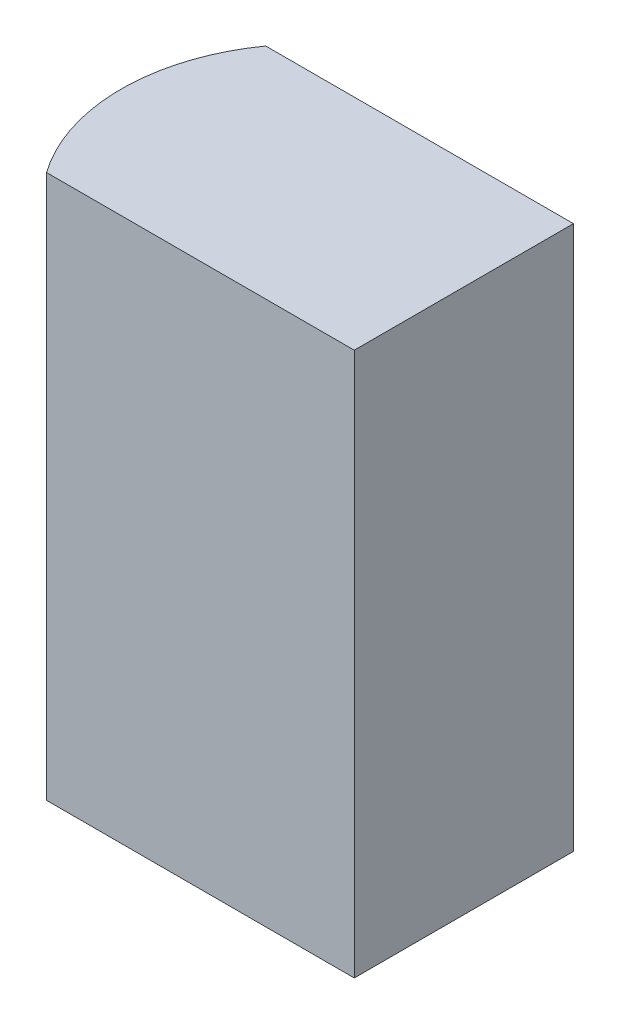
ISO-10303-21;
HEADER;
FILE_DESCRIPTION(('STEP AP214'),'2;1');
FILE_NAME('part.step','',(''),(''),'','','');
FILE_SCHEMA(('AUTOMOTIVE_DESIGN { 1 0 10303 214 1 1 1 1 }'));
ENDSEC;
DATA;
#1=APPLICATION_CONTEXT('core data for automotive mechanical design processes');
#2=APPLICATION_PROTOCOL_DEFINITION('international standard','automotive_design',2000,#1);
#3=PRODUCT_CONTEXT('',#1,'mechanical');
#4=PRODUCT('Part','Part','',(#3));
#5=PRODUCT_RELATED_PRODUCT_CATEGORY('part','',(#4));
#6=PRODUCT_DEFINITION_FORMATION('','',#4);
#7=PRODUCT_DEFINITION_CONTEXT('part definition',#1,'design');
#8=PRODUCT_DEFINITION('design','',#6,#7);
#9=PRODUCT_DEFINITION_SHAPE('','',#8);
#10=(LENGTH_UNIT() NAMED_UNIT(*) SI_UNIT(.MILLI.,.METRE.));
#11=(NAMED_UNIT(*) PLANE_ANGLE_UNIT() SI_UNIT($,.RADIAN.));
#12=(NAMED_UNIT(*) SI_UNIT($,.STERADIAN.) SOLID_ANGLE_UNIT());
#13=UNCERTAINTY_MEASURE_WITH_UNIT(LENGTH_MEASURE(1.E-05),#10,'distance_accuracy_value','');
#14=(GEOMETRIC_REPRESENTATION_CONTEXT(3) GLOBAL_UNCERTAINTY_ASSIGNED_CONTEXT((#13)) GLOBAL_UNIT_ASSIGNED_CONTEXT((#10,
#11,#12)) REPRESENTATION_CONTEXT('',''));
#15=CARTESIAN_POINT('',(0.,0.,0.));
#16=DIRECTION('',(0.,0.,1.));
#17=DIRECTION('',(1.,0.,0.));
#18=AXIS2_PLACEMENT_3D('',#15,#16,#17);
#19=CARTESIAN_POINT('',(182.5,645.,130.));
#20=DIRECTION('',(-1.,0.,0.));
#21=DIRECTION('',(0.,0.,1.));
#22=AXIS2_PLACEMENT_3D('',#19,#20,#21);
#23=PLANE('',#22);
#24=DIRECTION('',(0.,0.,-1.));
#25=VECTOR('',#24,1.);
#26=CARTESIAN_POINT('',(182.5,0.,130.));
#27=LINE('',#26,#25);
#28=CARTESIAN_POINT('',(182.5,0.,130.));
#29=VERTEX_POINT('',#28);
#30=CARTESIAN_POINT('',(182.5,0.,-130.));
#31=VERTEX_POINT('',#30);
#32=EDGE_CURVE('E100',#29,#31,#27,.T.);
#33=ORIENTED_EDGE('',*,*,#32,.T.);
#34=DIRECTION('',(0.,-1.,0.));
#35=VECTOR('',#34,1.);
#36=CARTESIAN_POINT('',(182.5,645.,-130.));
#37=LINE('',#36,#35);
#38=CARTESIAN_POINT('',(182.5,645.,-130.));
#39=VERTEX_POINT('',#38);
#40=EDGE_CURVE('E11',#39,#31,#37,.T.);
#41=ORIENTED_EDGE('',*,*,#40,.F.);
#42=DIRECTION('',(0.,0.,-1.));
#43=VECTOR('',#42,1.);
#44=CARTESIAN_POINT('',(182.5,645.,130.));
#45=LINE('',#44,#43);
#46=CARTESIAN_POINT('',(182.5,645.,130.));
#47=VERTEX_POINT('',#46);
#48=EDGE_CURVE('E88',#47,#39,#45,.T.);
#49=ORIENTED_EDGE('',*,*,#48,.F.);
#50=DIRECTION('',(0.,-1.,0.));
#51=VECTOR('',#50,1.);
#52=CARTESIAN_POINT('',(182.5,645.,130.));
#53=LINE('',#52,#51);
#54=EDGE_CURVE('E96',#47,#29,#53,.T.);
#55=ORIENTED_EDGE('',*,*,#54,.T.);
#56=EDGE_LOOP('',(#33,#41,#49,#55));
#57=FACE_BOUND('',#56,.T.);
#58=ADVANCED_FACE('F37',(#57),#23,.F.);
#59=CARTESIAN_POINT('',(-182.5,645.,-130.));
#60=DIRECTION('',(0.,0.,1.));
#61=DIRECTION('',(1.,0.,0.));
#62=AXIS2_PLACEMENT_3D('',#59,#60,#61);
#63=PLANE('',#62);
#64=DIRECTION('',(-1.,0.,0.));
#65=VECTOR('',#64,1.);
#66=CARTESIAN_POINT('',(-182.5,0.,-130.));
#67=LINE('',#66,#65);
#68=CARTESIAN_POINT('',(-182.5,0.,-130.));
#69=VERTEX_POINT('',#68);
#70=EDGE_CURVE('E92',#31,#69,#67,.T.);
#71=ORIENTED_EDGE('',*,*,#70,.T.);
#72=DIRECTION('',(0.,-1.,0.));
#73=VECTOR('',#72,1.);
#74=CARTESIAN_POINT('',(-182.5,645.,-130.));
#75=LINE('',#74,#73);
#76=CARTESIAN_POINT('',(-182.5,645.,-130.));
#77=VERTEX_POINT('',#76);
#78=EDGE_CURVE('E45',#77,#69,#75,.T.);
#79=ORIENTED_EDGE('',*,*,#78,.F.);
#80=DIRECTION('',(-1.,0.,0.));
#81=VECTOR('',#80,1.);
#82=CARTESIAN_POINT('',(-182.5,645.,-130.));
#83=LINE('',#82,#81);
#84=EDGE_CURVE('E83',#39,#77,#83,.T.);
#85=ORIENTED_EDGE('',*,*,#84,.F.);
#86=ORIENTED_EDGE('',*,*,#40,.T.);
#87=EDGE_LOOP('',(#71,#79,#85,#86));
#88=FACE_BOUND('',#87,.T.);
#89=ADVANCED_FACE('F91',(#88),#63,.F.);
#90=CARTESIAN_POINT('',(0.,645.,0.));
#91=DIRECTION('',(0.,-1.,0.));
#92=DIRECTION('',(0.,0.,-1.));
#93=AXIS2_PLACEMENT_3D('',#90,#91,#92);
#94=CYLINDRICAL_SURFACE('',#93,224.067512147567);
#95=CARTESIAN_POINT('',(0.,0.,0.));
#96=DIRECTION('',(0.,1.,0.));
#97=DIRECTION('',(0.,0.,1.));
#98=AXIS2_PLACEMENT_3D('',#95,#96,#97);
#99=CIRCLE('',#98,224.067512147567);
#100=CARTESIAN_POINT('',(-182.5,0.,130.));
#101=VERTEX_POINT('',#100);
#102=EDGE_CURVE('E70',#69,#101,#99,.T.);
#103=ORIENTED_EDGE('',*,*,#102,.T.);
#104=DIRECTION('',(0.,-1.,0.));
#105=VECTOR('',#104,1.);
#106=CARTESIAN_POINT('',(-182.5,645.,130.));
#107=LINE('',#106,#105);
#108=CARTESIAN_POINT('',(-182.5,645.,130.));
#109=VERTEX_POINT('',#108);
#110=EDGE_CURVE('E93',#109,#101,#107,.T.);
#111=ORIENTED_EDGE('',*,*,#110,.F.);
#112=CARTESIAN_POINT('',(0.,645.,0.));
#113=DIRECTION('',(0.,1.,0.));
#114=DIRECTION('',(0.,0.,1.));
#115=AXIS2_PLACEMENT_3D('',#112,#113,#114);
#116=CIRCLE('',#115,224.067512147567);
#117=EDGE_CURVE('E86',#77,#109,#116,.T.);
#118=ORIENTED_EDGE('',*,*,#117,.F.);
#119=ORIENTED_EDGE('',*,*,#78,.T.);
#120=EDGE_LOOP('',(#103,#111,#118,#119));
#121=FACE_BOUND('',#120,.T.);
#122=ADVANCED_FACE('F94',(#121),#94,.T.);
#123=CARTESIAN_POINT('',(-182.5,645.,130.));
#124=DIRECTION('',(0.,0.,-1.));
#125=DIRECTION('',(-1.,0.,0.));
#126=AXIS2_PLACEMENT_3D('',#123,#124,#125);
#127=PLANE('',#126);
#128=DIRECTION('',(1.,0.,0.));
#129=VECTOR('',#128,1.);
#130=CARTESIAN_POINT('',(-182.5,0.,130.));
#131=LINE('',#130,#129);
#132=EDGE_CURVE('E76',#101,#29,#131,.T.);
#133=ORIENTED_EDGE('',*,*,#132,.T.);
#134=ORIENTED_EDGE('',*,*,#54,.F.);
#135=DIRECTION('',(1.,0.,0.));
#136=VECTOR('',#135,1.);
#137=CARTESIAN_POINT('',(-182.5,645.,130.));
#138=LINE('',#137,#136);
#139=EDGE_CURVE('E53',#109,#47,#138,.T.);
#140=ORIENTED_EDGE('',*,*,#139,.F.);
#141=ORIENTED_EDGE('',*,*,#110,.T.);
#142=EDGE_LOOP('',(#133,#134,#140,#141));
#143=FACE_BOUND('',#142,.T.);
#144=ADVANCED_FACE('F107',(#143),#127,.F.);
#145=CARTESIAN_POINT('',(0.,645.,0.));
#146=DIRECTION('',(0.,1.,0.));
#147=DIRECTION('',(0.,0.,1.));
#148=AXIS2_PLACEMENT_3D('',#145,#146,#147);
#149=PLANE('',#148);
#150=ORIENTED_EDGE('',*,*,#48,.T.);
#151=ORIENTED_EDGE('',*,*,#84,.T.);
#152=ORIENTED_EDGE('',*,*,#117,.T.);
#153=ORIENTED_EDGE('',*,*,#139,.T.);
#154=EDGE_LOOP('',(#150,#151,#152,#153));
#155=FACE_BOUND('',#154,.T.);
#156=ADVANCED_FACE('F84',(#155),#149,.T.);
#157=CARTESIAN_POINT('',(0.,0.,0.));
#158=DIRECTION('',(0.,1.,0.));
#159=DIRECTION('',(0.,0.,1.));
#160=AXIS2_PLACEMENT_3D('',#157,#158,#159);
#161=PLANE('',#160);
#162=ORIENTED_EDGE('',*,*,#32,.F.);
#163=ORIENTED_EDGE('',*,*,#132,.F.);
#164=ORIENTED_EDGE('',*,*,#102,.F.);
#165=ORIENTED_EDGE('',*,*,#70,.F.);
#166=EDGE_LOOP('',(#162,#163,#164,#165));
#167=FACE_BOUND('',#166,.T.);
#168=ADVANCED_FACE('F110',(#167),#161,.F.);
#169=CLOSED_SHELL('',(#58,#89,#122,#144,#156,#168));
#170=MANIFOLD_SOLID_BREP('B2',#169);
#171=ADVANCED_BREP_SHAPE_REPRESENTATION('',(#18,#170),#14);
#172=SHAPE_DEFINITION_REPRESENTATION(#9,#171);
ENDSEC;
END-ISO-10303-21;
